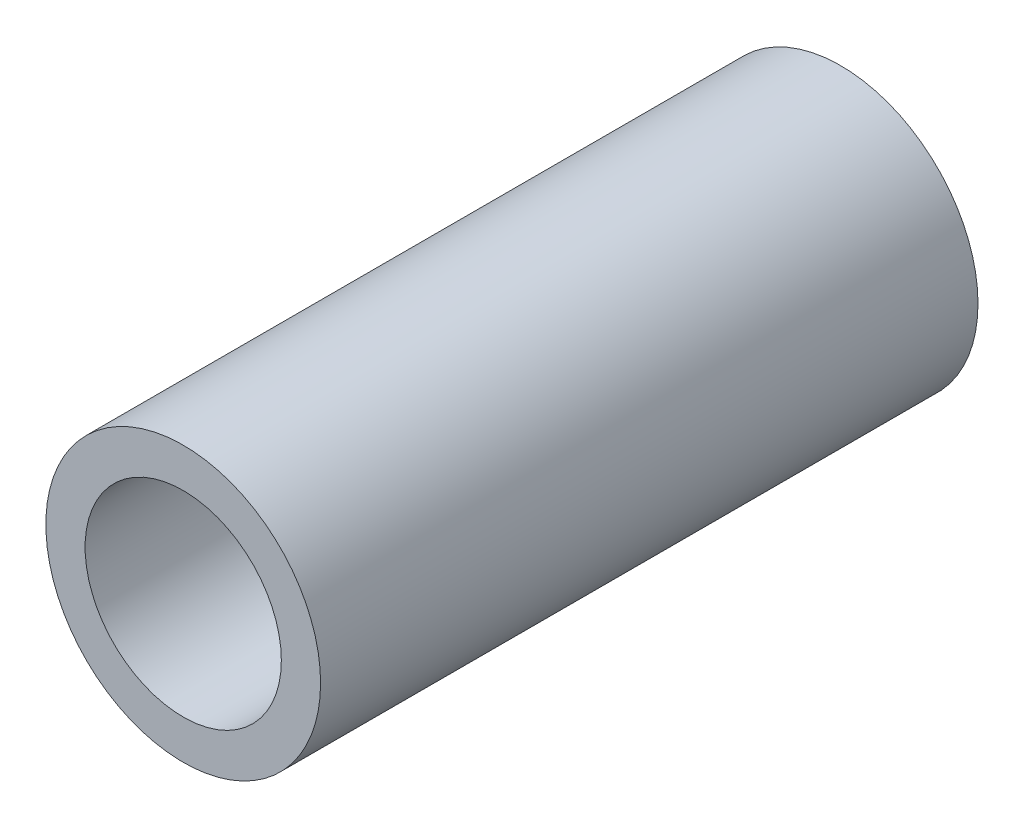
ISO-10303-21;
HEADER;
FILE_DESCRIPTION(('STEP AP214'),'2;1');
FILE_NAME('part.step','',(''),(''),'','','');
FILE_SCHEMA(('AUTOMOTIVE_DESIGN { 1 0 10303 214 1 1 1 1 }'));
ENDSEC;
DATA;
#1=APPLICATION_CONTEXT('core data for automotive mechanical design processes');
#2=APPLICATION_PROTOCOL_DEFINITION('international standard','automotive_design',2000,#1);
#3=PRODUCT_CONTEXT('',#1,'mechanical');
#4=PRODUCT('Part','Part','',(#3));
#5=PRODUCT_RELATED_PRODUCT_CATEGORY('part','',(#4));
#6=PRODUCT_DEFINITION_FORMATION('','',#4);
#7=PRODUCT_DEFINITION_CONTEXT('part definition',#1,'design');
#8=PRODUCT_DEFINITION('design','',#6,#7);
#9=PRODUCT_DEFINITION_SHAPE('','',#8);
#10=(LENGTH_UNIT() NAMED_UNIT(*) SI_UNIT(.MILLI.,.METRE.));
#11=(NAMED_UNIT(*) PLANE_ANGLE_UNIT() SI_UNIT($,.RADIAN.));
#12=(NAMED_UNIT(*) SI_UNIT($,.STERADIAN.) SOLID_ANGLE_UNIT());
#13=UNCERTAINTY_MEASURE_WITH_UNIT(LENGTH_MEASURE(1.E-05),#10,'distance_accuracy_value','');
#14=(GEOMETRIC_REPRESENTATION_CONTEXT(3) GLOBAL_UNCERTAINTY_ASSIGNED_CONTEXT((#13)) GLOBAL_UNIT_ASSIGNED_CONTEXT((#10,
#11,#12)) REPRESENTATION_CONTEXT('',''));
#15=CARTESIAN_POINT('',(0.,0.,0.));
#16=DIRECTION('',(0.,0.,1.));
#17=DIRECTION('',(1.,0.,0.));
#18=AXIS2_PLACEMENT_3D('',#15,#16,#17);
#19=CARTESIAN_POINT('',(0.,0.,2.99999999999999));
#20=DIRECTION('',(0.,0.,1.));
#21=DIRECTION('',(1.,0.,0.));
#22=AXIS2_PLACEMENT_3D('',#19,#20,#21);
#23=CYLINDRICAL_SURFACE('',#22,10.);
#24=CARTESIAN_POINT('',(0.,0.,2.99999999999999));
#25=DIRECTION('',(0.,0.,1.));
#26=DIRECTION('',(1.,0.,0.));
#27=AXIS2_PLACEMENT_3D('',#24,#25,#26);
#28=CIRCLE('',#27,10.);
#29=CARTESIAN_POINT('',(10.,0.,2.99999999999999));
#30=VERTEX_POINT('',#29);
#31=EDGE_CURVE('E48',#30,#30,#28,.T.);
#32=ORIENTED_EDGE('',*,*,#31,.F.);
#33=EDGE_LOOP('',(#32));
#34=FACE_BOUND('',#33,.T.);
#35=CARTESIAN_POINT('',(0.,0.,70.));
#36=DIRECTION('',(0.,0.,1.));
#37=DIRECTION('',(1.,0.,0.));
#38=AXIS2_PLACEMENT_3D('',#35,#36,#37);
#39=CIRCLE('',#38,10.);
#40=CARTESIAN_POINT('',(10.,0.,70.));
#41=VERTEX_POINT('',#40);
#42=EDGE_CURVE('E53',#41,#41,#39,.T.);
#43=ORIENTED_EDGE('',*,*,#42,.T.);
#44=EDGE_LOOP('',(#43));
#45=FACE_BOUND('',#44,.T.);
#46=ADVANCED_FACE('F41',(#34,#45),#23,.F.);
#47=CARTESIAN_POINT('',(0.,0.,2.99999999999999));
#48=DIRECTION('',(0.,0.,1.));
#49=DIRECTION('',(1.,0.,0.));
#50=AXIS2_PLACEMENT_3D('',#47,#48,#49);
#51=CYLINDRICAL_SURFACE('',#50,14.);
#52=CARTESIAN_POINT('',(0.,0.,2.99999999999999));
#53=DIRECTION('',(0.,0.,1.));
#54=DIRECTION('',(1.,0.,0.));
#55=AXIS2_PLACEMENT_3D('',#52,#53,#54);
#56=CIRCLE('',#55,14.);
#57=CARTESIAN_POINT('',(14.,0.,2.99999999999999));
#58=VERTEX_POINT('',#57);
#59=EDGE_CURVE('E10',#58,#58,#56,.T.);
#60=ORIENTED_EDGE('',*,*,#59,.T.);
#61=EDGE_LOOP('',(#60));
#62=FACE_BOUND('',#61,.T.);
#63=CARTESIAN_POINT('',(0.,0.,70.));
#64=DIRECTION('',(0.,0.,1.));
#65=DIRECTION('',(1.,0.,0.));
#66=AXIS2_PLACEMENT_3D('',#63,#64,#65);
#67=CIRCLE('',#66,14.);
#68=CARTESIAN_POINT('',(14.,0.,70.));
#69=VERTEX_POINT('',#68);
#70=EDGE_CURVE('E42',#69,#69,#67,.T.);
#71=ORIENTED_EDGE('',*,*,#70,.F.);
#72=EDGE_LOOP('',(#71));
#73=FACE_BOUND('',#72,.T.);
#74=ADVANCED_FACE('F62',(#62,#73),#51,.T.);
#75=CARTESIAN_POINT('',(0.,0.,2.99999999999999));
#76=DIRECTION('',(0.,0.,1.));
#77=DIRECTION('',(1.,0.,0.));
#78=AXIS2_PLACEMENT_3D('',#75,#76,#77);
#79=PLANE('',#78);
#80=ORIENTED_EDGE('',*,*,#31,.T.);
#81=EDGE_LOOP('',(#80));
#82=FACE_BOUND('',#81,.T.);
#83=ORIENTED_EDGE('',*,*,#59,.F.);
#84=EDGE_LOOP('',(#83));
#85=FACE_BOUND('',#84,.T.);
#86=ADVANCED_FACE('F64',(#82,#85),#79,.F.);
#87=CARTESIAN_POINT('',(0.,0.,70.));
#88=DIRECTION('',(0.,0.,1.));
#89=DIRECTION('',(1.,0.,0.));
#90=AXIS2_PLACEMENT_3D('',#87,#88,#89);
#91=PLANE('',#90);
#92=ORIENTED_EDGE('',*,*,#42,.F.);
#93=EDGE_LOOP('',(#92));
#94=FACE_BOUND('',#93,.T.);
#95=ORIENTED_EDGE('',*,*,#70,.T.);
#96=EDGE_LOOP('',(#95));
#97=FACE_BOUND('',#96,.T.);
#98=ADVANCED_FACE('F61',(#94,#97),#91,.T.);
#99=CLOSED_SHELL('',(#46,#74,#86,#98));
#100=MANIFOLD_SOLID_BREP('B2',#99);
#101=ADVANCED_BREP_SHAPE_REPRESENTATION('',(#18,#100),#14);
#102=SHAPE_DEFINITION_REPRESENTATION(#9,#101);
ENDSEC;
END-ISO-10303-21;
